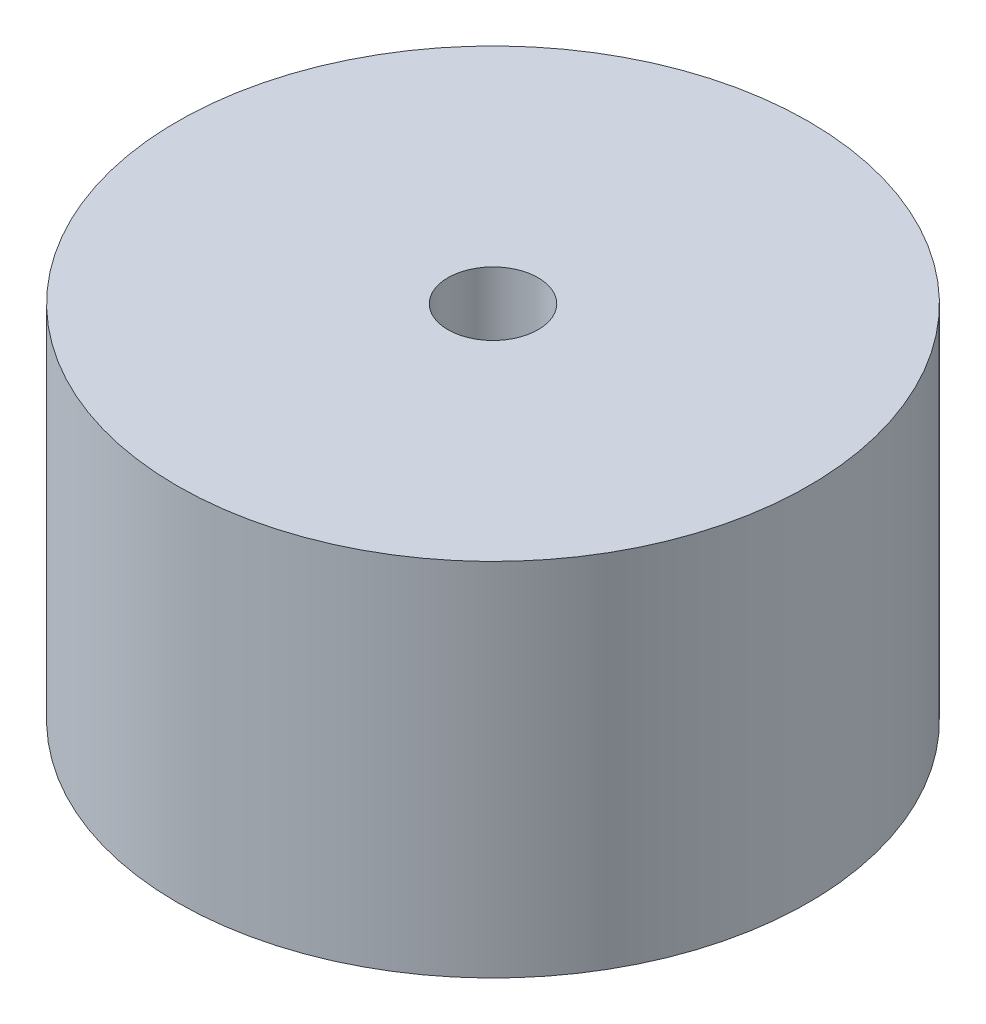
ISO-10303-21;
HEADER;
FILE_DESCRIPTION(('STEP AP214'),'2;1');
FILE_NAME('part.step','',(''),(''),'','','');
FILE_SCHEMA(('AUTOMOTIVE_DESIGN { 1 0 10303 214 1 1 1 1 }'));
ENDSEC;
DATA;
#1=APPLICATION_CONTEXT('core data for automotive mechanical design processes');
#2=APPLICATION_PROTOCOL_DEFINITION('international standard','automotive_design',2000,#1);
#3=PRODUCT_CONTEXT('',#1,'mechanical');
#4=PRODUCT('Part','Part','',(#3));
#5=PRODUCT_RELATED_PRODUCT_CATEGORY('part','',(#4));
#6=PRODUCT_DEFINITION_FORMATION('','',#4);
#7=PRODUCT_DEFINITION_CONTEXT('part definition',#1,'design');
#8=PRODUCT_DEFINITION('design','',#6,#7);
#9=PRODUCT_DEFINITION_SHAPE('','',#8);
#10=(LENGTH_UNIT() NAMED_UNIT(*) SI_UNIT(.MILLI.,.METRE.));
#11=(NAMED_UNIT(*) PLANE_ANGLE_UNIT() SI_UNIT($,.RADIAN.));
#12=(NAMED_UNIT(*) SI_UNIT($,.STERADIAN.) SOLID_ANGLE_UNIT());
#13=UNCERTAINTY_MEASURE_WITH_UNIT(LENGTH_MEASURE(1.E-05),#10,'distance_accuracy_value','');
#14=(GEOMETRIC_REPRESENTATION_CONTEXT(3) GLOBAL_UNCERTAINTY_ASSIGNED_CONTEXT((#13)) GLOBAL_UNIT_ASSIGNED_CONTEXT((#10,
#11,#12)) REPRESENTATION_CONTEXT('',''));
#15=CARTESIAN_POINT('',(0.,0.,0.));
#16=DIRECTION('',(0.,0.,1.));
#17=DIRECTION('',(1.,0.,0.));
#18=AXIS2_PLACEMENT_3D('',#15,#16,#17);
#19=CARTESIAN_POINT('',(0.,-25.4,0.));
#20=DIRECTION('',(0.,1.,0.));
#21=DIRECTION('',(0.,0.,1.));
#22=AXIS2_PLACEMENT_3D('',#19,#20,#21);
#23=CYLINDRICAL_SURFACE('',#22,22.225);
#24=CARTESIAN_POINT('',(0.,-25.4,0.));
#25=DIRECTION('',(0.,1.,0.));
#26=DIRECTION('',(0.,0.,1.));
#27=AXIS2_PLACEMENT_3D('',#24,#25,#26);
#28=CIRCLE('',#27,22.225);
#29=CARTESIAN_POINT('',(0.,-25.4,22.225));
#30=VERTEX_POINT('',#29);
#31=EDGE_CURVE('E10',#30,#30,#28,.T.);
#32=ORIENTED_EDGE('',*,*,#31,.T.);
#33=EDGE_LOOP('',(#32));
#34=FACE_BOUND('',#33,.T.);
#35=CARTESIAN_POINT('',(0.,0.,0.));
#36=DIRECTION('',(0.,1.,0.));
#37=DIRECTION('',(0.,0.,1.));
#38=AXIS2_PLACEMENT_3D('',#35,#36,#37);
#39=CIRCLE('',#38,22.225);
#40=CARTESIAN_POINT('',(0.,0.,22.225));
#41=VERTEX_POINT('',#40);
#42=EDGE_CURVE('E34',#41,#41,#39,.T.);
#43=ORIENTED_EDGE('',*,*,#42,.F.);
#44=EDGE_LOOP('',(#43));
#45=FACE_BOUND('',#44,.T.);
#46=ADVANCED_FACE('F31',(#34,#45),#23,.T.);
#47=CARTESIAN_POINT('',(0.,-25.4,0.));
#48=DIRECTION('',(0.,1.,0.));
#49=DIRECTION('',(0.,0.,1.));
#50=AXIS2_PLACEMENT_3D('',#47,#48,#49);
#51=PLANE('',#50);
#52=CARTESIAN_POINT('',(0.,-25.4,0.));
#53=DIRECTION('',(0.,1.,0.));
#54=DIRECTION('',(0.,0.,1.));
#55=AXIS2_PLACEMENT_3D('',#52,#53,#54);
#56=CIRCLE('',#55,3.175);
#57=CARTESIAN_POINT('',(0.,-25.4,3.175));
#58=VERTEX_POINT('',#57);
#59=EDGE_CURVE('E41',#58,#58,#56,.T.);
#60=ORIENTED_EDGE('',*,*,#59,.T.);
#61=EDGE_LOOP('',(#60));
#62=FACE_BOUND('',#61,.T.);
#63=ORIENTED_EDGE('',*,*,#31,.F.);
#64=EDGE_LOOP('',(#63));
#65=FACE_BOUND('',#64,.T.);
#66=ADVANCED_FACE('F49',(#62,#65),#51,.F.);
#67=CARTESIAN_POINT('',(0.,0.,0.));
#68=DIRECTION('',(0.,1.,0.));
#69=DIRECTION('',(0.,0.,1.));
#70=AXIS2_PLACEMENT_3D('',#67,#68,#69);
#71=PLANE('',#70);
#72=CARTESIAN_POINT('',(0.,0.,0.));
#73=DIRECTION('',(0.,1.,0.));
#74=DIRECTION('',(0.,0.,1.));
#75=AXIS2_PLACEMENT_3D('',#72,#73,#74);
#76=CIRCLE('',#75,3.175);
#77=CARTESIAN_POINT('',(0.,0.,3.175));
#78=VERTEX_POINT('',#77);
#79=EDGE_CURVE('E43',#78,#78,#76,.T.);
#80=ORIENTED_EDGE('',*,*,#79,.F.);
#81=EDGE_LOOP('',(#80));
#82=FACE_BOUND('',#81,.T.);
#83=ORIENTED_EDGE('',*,*,#42,.T.);
#84=EDGE_LOOP('',(#83));
#85=FACE_BOUND('',#84,.T.);
#86=ADVANCED_FACE('F55',(#82,#85),#71,.T.);
#87=CARTESIAN_POINT('',(0.,-25.4,0.));
#88=DIRECTION('',(0.,1.,0.));
#89=DIRECTION('',(0.,0.,1.));
#90=AXIS2_PLACEMENT_3D('',#87,#88,#89);
#91=CYLINDRICAL_SURFACE('',#90,3.175);
#92=ORIENTED_EDGE('',*,*,#59,.F.);
#93=EDGE_LOOP('',(#92));
#94=FACE_BOUND('',#93,.T.);
#95=ORIENTED_EDGE('',*,*,#79,.T.);
#96=EDGE_LOOP('',(#95));
#97=FACE_BOUND('',#96,.T.);
#98=ADVANCED_FACE('F52',(#94,#97),#91,.F.);
#99=CLOSED_SHELL('',(#46,#66,#86,#98));
#100=MANIFOLD_SOLID_BREP('B2',#99);
#101=ADVANCED_BREP_SHAPE_REPRESENTATION('',(#18,#100),#14);
#102=SHAPE_DEFINITION_REPRESENTATION(#9,#101);
ENDSEC;
END-ISO-10303-21;
